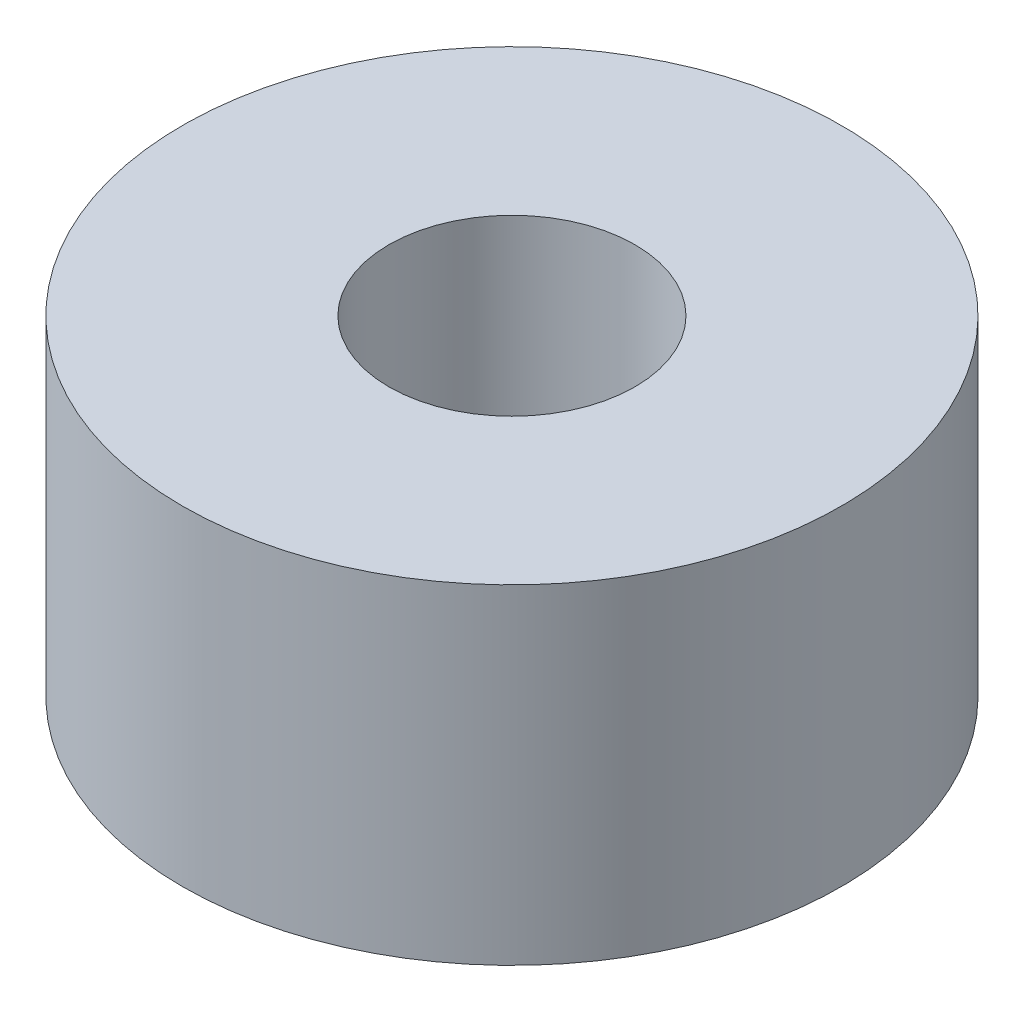
ISO-10303-21;
HEADER;
FILE_DESCRIPTION(('STEP AP214'),'2;1');
FILE_NAME('part.step','',(''),(''),'','','');
FILE_SCHEMA(('AUTOMOTIVE_DESIGN { 1 0 10303 214 1 1 1 1 }'));
ENDSEC;
DATA;
#1=APPLICATION_CONTEXT('core data for automotive mechanical design processes');
#2=APPLICATION_PROTOCOL_DEFINITION('international standard','automotive_design',2000,#1);
#3=PRODUCT_CONTEXT('',#1,'mechanical');
#4=PRODUCT('Part','Part','',(#3));
#5=PRODUCT_RELATED_PRODUCT_CATEGORY('part','',(#4));
#6=PRODUCT_DEFINITION_FORMATION('','',#4);
#7=PRODUCT_DEFINITION_CONTEXT('part definition',#1,'design');
#8=PRODUCT_DEFINITION('design','',#6,#7);
#9=PRODUCT_DEFINITION_SHAPE('','',#8);
#10=(LENGTH_UNIT() NAMED_UNIT(*) SI_UNIT(.MILLI.,.METRE.));
#11=(NAMED_UNIT(*) PLANE_ANGLE_UNIT() SI_UNIT($,.RADIAN.));
#12=(NAMED_UNIT(*) SI_UNIT($,.STERADIAN.) SOLID_ANGLE_UNIT());
#13=UNCERTAINTY_MEASURE_WITH_UNIT(LENGTH_MEASURE(1.E-05),#10,'distance_accuracy_value','');
#14=(GEOMETRIC_REPRESENTATION_CONTEXT(3) GLOBAL_UNCERTAINTY_ASSIGNED_CONTEXT((#13)) GLOBAL_UNIT_ASSIGNED_CONTEXT((#10,
#11,#12)) REPRESENTATION_CONTEXT('',''));
#15=CARTESIAN_POINT('',(0.,0.,0.));
#16=DIRECTION('',(0.,0.,1.));
#17=DIRECTION('',(1.,0.,0.));
#18=AXIS2_PLACEMENT_3D('',#15,#16,#17);
#19=CARTESIAN_POINT('',(0.,8.5,0.));
#20=DIRECTION('',(0.,1.,0.));
#21=DIRECTION('',(0.,0.,1.));
#22=AXIS2_PLACEMENT_3D('',#19,#20,#21);
#23=PLANE('',#22);
#24=CARTESIAN_POINT('',(0.,8.5,0.));
#25=DIRECTION('',(0.,1.,0.));
#26=DIRECTION('',(0.,0.,1.));
#27=AXIS2_PLACEMENT_3D('',#24,#25,#26);
#28=CIRCLE('',#27,8.5);
#29=CARTESIAN_POINT('',(0.,8.5,8.5));
#30=VERTEX_POINT('',#29);
#31=EDGE_CURVE('E10',#30,#30,#28,.T.);
#32=ORIENTED_EDGE('',*,*,#31,.T.);
#33=EDGE_LOOP('',(#32));
#34=FACE_BOUND('',#33,.T.);
#35=CARTESIAN_POINT('',(0.,8.5,0.));
#36=DIRECTION('',(0.,1.,0.));
#37=DIRECTION('',(0.,0.,1.));
#38=AXIS2_PLACEMENT_3D('',#35,#36,#37);
#39=CIRCLE('',#38,3.175);
#40=CARTESIAN_POINT('',(0.,8.5,3.175));
#41=VERTEX_POINT('',#40);
#42=EDGE_CURVE('E40',#41,#41,#39,.T.);
#43=ORIENTED_EDGE('',*,*,#42,.F.);
#44=EDGE_LOOP('',(#43));
#45=FACE_BOUND('',#44,.T.);
#46=ADVANCED_FACE('F29',(#34,#45),#23,.T.);
#47=CARTESIAN_POINT('',(0.,0.,0.));
#48=DIRECTION('',(0.,1.,0.));
#49=DIRECTION('',(0.,0.,1.));
#50=AXIS2_PLACEMENT_3D('',#47,#48,#49);
#51=PLANE('',#50);
#52=CARTESIAN_POINT('',(0.,0.,0.));
#53=DIRECTION('',(0.,1.,0.));
#54=DIRECTION('',(0.,0.,1.));
#55=AXIS2_PLACEMENT_3D('',#52,#53,#54);
#56=CIRCLE('',#55,8.5);
#57=CARTESIAN_POINT('',(0.,0.,8.5));
#58=VERTEX_POINT('',#57);
#59=EDGE_CURVE('E33',#58,#58,#56,.T.);
#60=ORIENTED_EDGE('',*,*,#59,.F.);
#61=EDGE_LOOP('',(#60));
#62=FACE_BOUND('',#61,.T.);
#63=CARTESIAN_POINT('',(0.,0.,0.));
#64=DIRECTION('',(0.,1.,0.));
#65=DIRECTION('',(0.,0.,1.));
#66=AXIS2_PLACEMENT_3D('',#63,#64,#65);
#67=CIRCLE('',#66,3.175);
#68=CARTESIAN_POINT('',(0.,0.,3.175));
#69=VERTEX_POINT('',#68);
#70=EDGE_CURVE('E42',#69,#69,#67,.T.);
#71=ORIENTED_EDGE('',*,*,#70,.T.);
#72=EDGE_LOOP('',(#71));
#73=FACE_BOUND('',#72,.T.);
#74=ADVANCED_FACE('F52',(#62,#73),#51,.F.);
#75=CARTESIAN_POINT('',(0.,8.5,0.));
#76=DIRECTION('',(0.,-1.,0.));
#77=DIRECTION('',(0.,0.,-1.));
#78=AXIS2_PLACEMENT_3D('',#75,#76,#77);
#79=CYLINDRICAL_SURFACE('',#78,8.5);
#80=ORIENTED_EDGE('',*,*,#31,.F.);
#81=EDGE_LOOP('',(#80));
#82=FACE_BOUND('',#81,.T.);
#83=ORIENTED_EDGE('',*,*,#59,.T.);
#84=EDGE_LOOP('',(#83));
#85=FACE_BOUND('',#84,.T.);
#86=ADVANCED_FACE('F31',(#82,#85),#79,.T.);
#87=CARTESIAN_POINT('',(0.,8.5,0.));
#88=DIRECTION('',(0.,-1.,0.));
#89=DIRECTION('',(0.,0.,-1.));
#90=AXIS2_PLACEMENT_3D('',#87,#88,#89);
#91=CYLINDRICAL_SURFACE('',#90,3.175);
#92=ORIENTED_EDGE('',*,*,#42,.T.);
#93=EDGE_LOOP('',(#92));
#94=FACE_BOUND('',#93,.T.);
#95=ORIENTED_EDGE('',*,*,#70,.F.);
#96=EDGE_LOOP('',(#95));
#97=FACE_BOUND('',#96,.T.);
#98=ADVANCED_FACE('F48',(#94,#97),#91,.F.);
#99=CLOSED_SHELL('',(#46,#74,#86,#98));
#100=MANIFOLD_SOLID_BREP('B2',#99);
#101=ADVANCED_BREP_SHAPE_REPRESENTATION('',(#18,#100),#14);
#102=SHAPE_DEFINITION_REPRESENTATION(#9,#101);
ENDSEC;
END-ISO-10303-21;
